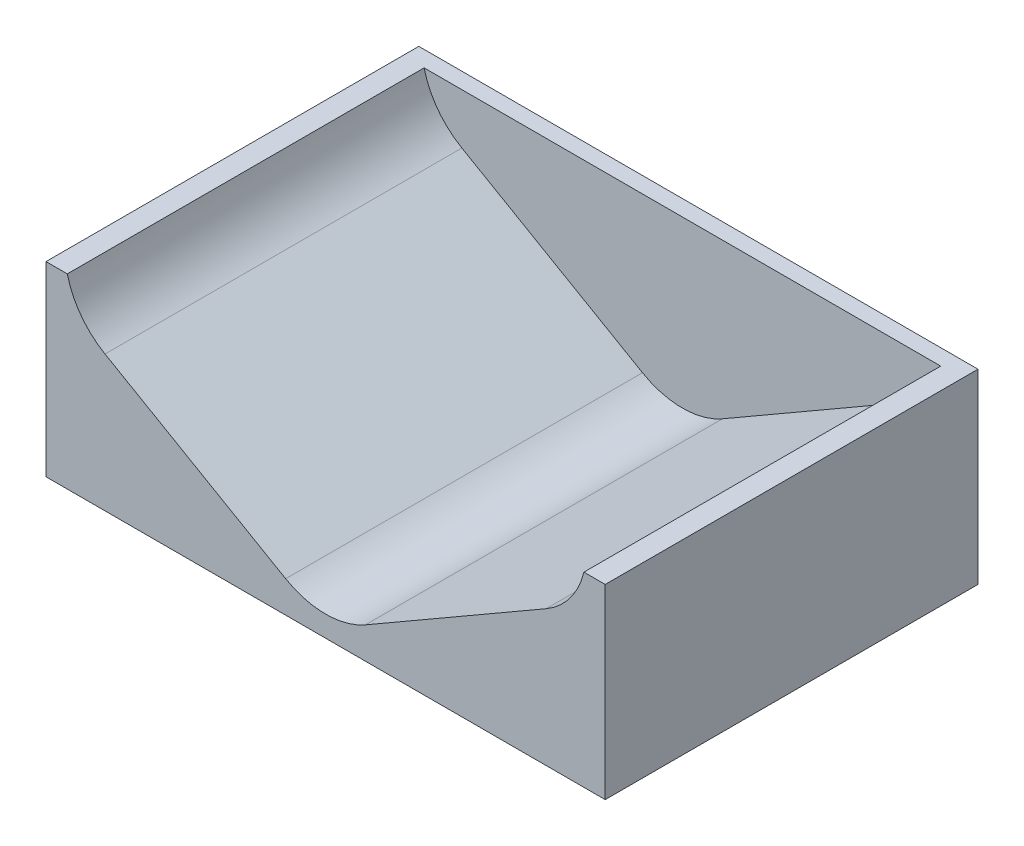
ISO-10303-21;
HEADER;
FILE_DESCRIPTION(('STEP AP214'),'2;1');
FILE_NAME('part.step','',(''),(''),'','','');
FILE_SCHEMA(('AUTOMOTIVE_DESIGN { 1 0 10303 214 1 1 1 1 }'));
ENDSEC;
DATA;
#1=APPLICATION_CONTEXT('core data for automotive mechanical design processes');
#2=APPLICATION_PROTOCOL_DEFINITION('international standard','automotive_design',2000,#1);
#3=PRODUCT_CONTEXT('',#1,'mechanical');
#4=PRODUCT('Part','Part','',(#3));
#5=PRODUCT_RELATED_PRODUCT_CATEGORY('part','',(#4));
#6=PRODUCT_DEFINITION_FORMATION('','',#4);
#7=PRODUCT_DEFINITION_CONTEXT('part definition',#1,'design');
#8=PRODUCT_DEFINITION('design','',#6,#7);
#9=PRODUCT_DEFINITION_SHAPE('','',#8);
#10=(LENGTH_UNIT() NAMED_UNIT(*) SI_UNIT(.MILLI.,.METRE.));
#11=(NAMED_UNIT(*) PLANE_ANGLE_UNIT() SI_UNIT($,.RADIAN.));
#12=(NAMED_UNIT(*) SI_UNIT($,.STERADIAN.) SOLID_ANGLE_UNIT());
#13=UNCERTAINTY_MEASURE_WITH_UNIT(LENGTH_MEASURE(1.E-05),#10,'distance_accuracy_value','');
#14=(GEOMETRIC_REPRESENTATION_CONTEXT(3) GLOBAL_UNCERTAINTY_ASSIGNED_CONTEXT((#13)) GLOBAL_UNIT_ASSIGNED_CONTEXT((#10,
#11,#12)) REPRESENTATION_CONTEXT('',''));
#15=CARTESIAN_POINT('',(0.,0.,0.));
#16=DIRECTION('',(0.,0.,1.));
#17=DIRECTION('',(1.,0.,0.));
#18=AXIS2_PLACEMENT_3D('',#15,#16,#17);
#19=CARTESIAN_POINT('',(-48.5,28.0014880556969,70.));
#20=DIRECTION('',(-0.500000000000001,-0.866025403784438,0.));
#21=DIRECTION('',(0.866025403784438,-0.500000000000001,0.));
#22=AXIS2_PLACEMENT_3D('',#19,#20,#21);
#23=PLANE('',#22);
#24=DIRECTION('',(0.866025403784438,-0.500000000000001,0.));
#25=VECTOR('',#24,1.);
#26=CARTESIAN_POINT('',(-48.5,28.0014880556969,3.));
#27=LINE('',#26,#25);
#28=CARTESIAN_POINT('',(-41.4142687030109,23.9105391839749,3.));
#29=VERTEX_POINT('',#28);
#30=CARTESIAN_POINT('',(-7.50000000000001,4.3301270189222,3.));
#31=VERTEX_POINT('',#30);
#32=EDGE_CURVE('E173',#29,#31,#27,.T.);
#33=ORIENTED_EDGE('',*,*,#32,.F.);
#34=DIRECTION('',(0.,0.,1.));
#35=VECTOR('',#34,1.);
#36=CARTESIAN_POINT('',(-41.4142687030109,23.9105391839749,70.));
#37=LINE('',#36,#35);
#38=CARTESIAN_POINT('',(-41.4142687030109,23.9105391839749,70.));
#39=VERTEX_POINT('',#38);
#40=EDGE_CURVE('E47',#29,#39,#37,.T.);
#41=ORIENTED_EDGE('',*,*,#40,.T.);
#42=DIRECTION('',(-0.866025403784438,0.500000000000001,0.));
#43=VECTOR('',#42,1.);
#44=CARTESIAN_POINT('',(-48.5,28.0014880556969,70.));
#45=LINE('',#44,#43);
#46=CARTESIAN_POINT('',(-7.50000000000001,4.33012701892221,70.));
#47=VERTEX_POINT('',#46);
#48=EDGE_CURVE('E167',#47,#39,#45,.T.);
#49=ORIENTED_EDGE('',*,*,#48,.F.);
#50=DIRECTION('',(0.,0.,-1.));
#51=VECTOR('',#50,1.);
#52=CARTESIAN_POINT('',(-7.50000000000001,4.33012701892221,0.));
#53=LINE('',#52,#51);
#54=EDGE_CURVE('E157',#47,#31,#53,.T.);
#55=ORIENTED_EDGE('',*,*,#54,.T.);
#56=EDGE_LOOP('',(#33,#41,#49,#55));
#57=FACE_BOUND('',#56,.T.);
#58=ADVANCED_FACE('F32',(#57),#23,.F.);
#59=CARTESIAN_POINT('',(0.,0.,70.));
#60=DIRECTION('',(0.500000000000001,-0.866025403784438,0.));
#61=DIRECTION('',(0.866025403784438,0.500000000000001,0.));
#62=AXIS2_PLACEMENT_3D('',#59,#60,#61);
#63=PLANE('',#62);
#64=DIRECTION('',(0.866025403784438,0.500000000000001,0.));
#65=VECTOR('',#64,1.);
#66=CARTESIAN_POINT('',(0.,0.,3.));
#67=LINE('',#66,#65);
#68=CARTESIAN_POINT('',(7.50000000000002,4.33012701892221,3.));
#69=VERTEX_POINT('',#68);
#70=CARTESIAN_POINT('',(41.414268703011,23.9105391839749,3.));
#71=VERTEX_POINT('',#70);
#72=EDGE_CURVE('E114',#69,#71,#67,.T.);
#73=ORIENTED_EDGE('',*,*,#72,.F.);
#74=DIRECTION('',(0.,0.,-1.));
#75=VECTOR('',#74,1.);
#76=CARTESIAN_POINT('',(7.50000000000001,4.33012701892221,70.));
#77=LINE('',#76,#75);
#78=CARTESIAN_POINT('',(7.50000000000002,4.33012701892221,70.));
#79=VERTEX_POINT('',#78);
#80=EDGE_CURVE('E153',#69,#79,#77,.F.);
#81=ORIENTED_EDGE('',*,*,#80,.T.);
#82=DIRECTION('',(-0.866025403784438,-0.500000000000001,0.));
#83=VECTOR('',#82,1.);
#84=CARTESIAN_POINT('',(0.,0.,70.));
#85=LINE('',#84,#83);
#86=CARTESIAN_POINT('',(41.414268703011,23.9105391839749,70.));
#87=VERTEX_POINT('',#86);
#88=EDGE_CURVE('E137',#87,#79,#85,.T.);
#89=ORIENTED_EDGE('',*,*,#88,.F.);
#90=DIRECTION('',(0.,0.,-1.));
#91=VECTOR('',#90,1.);
#92=CARTESIAN_POINT('',(41.4142687030109,23.9105391839749,70.));
#93=LINE('',#92,#91);
#94=EDGE_CURVE('E155',#87,#71,#93,.T.);
#95=ORIENTED_EDGE('',*,*,#94,.T.);
#96=EDGE_LOOP('',(#73,#81,#89,#95));
#97=FACE_BOUND('',#96,.T.);
#98=ADVANCED_FACE('F210',(#97),#63,.F.);
#99=CARTESIAN_POINT('',(33.9142687030109,36.9009202407415,70.));
#100=DIRECTION('',(0.,0.,-1.));
#101=DIRECTION('',(-1.,0.,0.));
#102=AXIS2_PLACEMENT_3D('',#99,#100,#101);
#103=CYLINDRICAL_SURFACE('',#102,15.);
#104=CARTESIAN_POINT('',(33.9142687030109,36.9009202407415,3.));
#105=DIRECTION('',(0.,0.,-1.));
#106=DIRECTION('',(-1.,0.,0.));
#107=AXIS2_PLACEMENT_3D('',#104,#105,#106);
#108=CIRCLE('',#107,15.);
#109=CARTESIAN_POINT('',(48.5,33.4,3.));
#110=VERTEX_POINT('',#109);
#111=EDGE_CURVE('E108',#71,#110,#108,.F.);
#112=ORIENTED_EDGE('',*,*,#111,.F.);
#113=ORIENTED_EDGE('',*,*,#94,.F.);
#114=CARTESIAN_POINT('',(33.9142687030109,36.9009202407415,70.));
#115=DIRECTION('',(0.,0.,1.));
#116=DIRECTION('',(1.,0.,0.));
#117=AXIS2_PLACEMENT_3D('',#114,#115,#116);
#118=CIRCLE('',#117,15.);
#119=CARTESIAN_POINT('',(48.5,33.4,70.));
#120=VERTEX_POINT('',#119);
#121=EDGE_CURVE('E135',#120,#87,#118,.F.);
#122=ORIENTED_EDGE('',*,*,#121,.F.);
#123=DIRECTION('',(0.,0.,-1.));
#124=VECTOR('',#123,1.);
#125=CARTESIAN_POINT('',(48.5,33.4,70.));
#126=LINE('',#125,#124);
#127=EDGE_CURVE('E128',#120,#110,#126,.T.);
#128=ORIENTED_EDGE('',*,*,#127,.T.);
#129=EDGE_LOOP('',(#112,#113,#122,#128));
#130=FACE_BOUND('',#129,.T.);
#131=ADVANCED_FACE('F134',(#130),#103,.F.);
#132=CARTESIAN_POINT('',(-33.9142687030109,36.9009202407415,70.));
#133=DIRECTION('',(0.,0.,1.));
#134=DIRECTION('',(1.,0.,0.));
#135=AXIS2_PLACEMENT_3D('',#132,#133,#134);
#136=CYLINDRICAL_SURFACE('',#135,15.);
#137=CARTESIAN_POINT('',(-33.9142687030109,36.9009202407415,3.));
#138=DIRECTION('',(0.,0.,-1.));
#139=DIRECTION('',(-1.,0.,0.));
#140=AXIS2_PLACEMENT_3D('',#137,#138,#139);
#141=CIRCLE('',#140,15.);
#142=CARTESIAN_POINT('',(-48.5,33.4,3.));
#143=VERTEX_POINT('',#142);
#144=EDGE_CURVE('E120',#143,#29,#141,.F.);
#145=ORIENTED_EDGE('',*,*,#144,.F.);
#146=DIRECTION('',(0.,0.,-1.));
#147=VECTOR('',#146,1.);
#148=CARTESIAN_POINT('',(-48.5,33.4,70.));
#149=LINE('',#148,#147);
#150=CARTESIAN_POINT('',(-48.5,33.4,70.));
#151=VERTEX_POINT('',#150);
#152=EDGE_CURVE('E132',#151,#143,#149,.T.);
#153=ORIENTED_EDGE('',*,*,#152,.F.);
#154=CARTESIAN_POINT('',(-33.9142687030109,36.9009202407415,70.));
#155=DIRECTION('',(0.,0.,1.));
#156=DIRECTION('',(1.,0.,0.));
#157=AXIS2_PLACEMENT_3D('',#154,#155,#156);
#158=CIRCLE('',#157,15.);
#159=EDGE_CURVE('E162',#39,#151,#158,.F.);
#160=ORIENTED_EDGE('',*,*,#159,.F.);
#161=ORIENTED_EDGE('',*,*,#40,.F.);
#162=EDGE_LOOP('',(#145,#153,#160,#161));
#163=FACE_BOUND('',#162,.T.);
#164=ADVANCED_FACE('F172',(#163),#136,.F.);
#165=CARTESIAN_POINT('',(0.,17.3205080756888,70.));
#166=DIRECTION('',(0.,0.,1.));
#167=DIRECTION('',(1.,0.,0.));
#168=AXIS2_PLACEMENT_3D('',#165,#166,#167);
#169=CYLINDRICAL_SURFACE('',#168,15.);
#170=CARTESIAN_POINT('',(0.,17.3205080756888,3.));
#171=DIRECTION('',(0.,0.,-1.));
#172=DIRECTION('',(-1.,0.,0.));
#173=AXIS2_PLACEMENT_3D('',#170,#171,#172);
#174=CIRCLE('',#173,15.);
#175=EDGE_CURVE('E11',#31,#69,#174,.F.);
#176=ORIENTED_EDGE('',*,*,#175,.F.);
#177=ORIENTED_EDGE('',*,*,#54,.F.);
#178=CARTESIAN_POINT('',(0.,17.3205080756888,70.));
#179=DIRECTION('',(0.,0.,1.));
#180=DIRECTION('',(1.,0.,0.));
#181=AXIS2_PLACEMENT_3D('',#178,#179,#180);
#182=CIRCLE('',#181,15.);
#183=EDGE_CURVE('E40',#79,#47,#182,.F.);
#184=ORIENTED_EDGE('',*,*,#183,.F.);
#185=ORIENTED_EDGE('',*,*,#80,.F.);
#186=EDGE_LOOP('',(#176,#177,#184,#185));
#187=FACE_BOUND('',#186,.T.);
#188=ADVANCED_FACE('F34',(#187),#169,.F.);
#189=CARTESIAN_POINT('',(-52.5,33.4,70.));
#190=DIRECTION('',(1.,0.,0.));
#191=DIRECTION('',(0.,0.,-1.));
#192=AXIS2_PLACEMENT_3D('',#189,#190,#191);
#193=PLANE('',#192);
#194=DIRECTION('',(0.,-1.,0.));
#195=VECTOR('',#194,1.);
#196=CARTESIAN_POINT('',(-52.5,33.4,0.));
#197=LINE('',#196,#195);
#198=CARTESIAN_POINT('',(-52.5,33.4,0.));
#199=VERTEX_POINT('',#198);
#200=CARTESIAN_POINT('',(-52.5,-1.60000000000001,0.));
#201=VERTEX_POINT('',#200);
#202=EDGE_CURVE('E119',#199,#201,#197,.T.);
#203=ORIENTED_EDGE('',*,*,#202,.T.);
#204=DIRECTION('',(0.,0.,-1.));
#205=VECTOR('',#204,1.);
#206=CARTESIAN_POINT('',(-52.5,-1.60000000000001,70.));
#207=LINE('',#206,#205);
#208=CARTESIAN_POINT('',(-52.5,-1.60000000000001,70.));
#209=VERTEX_POINT('',#208);
#210=EDGE_CURVE('E148',#209,#201,#207,.T.);
#211=ORIENTED_EDGE('',*,*,#210,.F.);
#212=DIRECTION('',(0.,-1.,0.));
#213=VECTOR('',#212,1.);
#214=CARTESIAN_POINT('',(-52.5,33.4,70.));
#215=LINE('',#214,#213);
#216=CARTESIAN_POINT('',(-52.5,33.4,70.));
#217=VERTEX_POINT('',#216);
#218=EDGE_CURVE('E170',#217,#209,#215,.T.);
#219=ORIENTED_EDGE('',*,*,#218,.F.);
#220=DIRECTION('',(0.,0.,-1.));
#221=VECTOR('',#220,1.);
#222=CARTESIAN_POINT('',(-52.5,33.4,70.));
#223=LINE('',#222,#221);
#224=EDGE_CURVE('E150',#217,#199,#223,.T.);
#225=ORIENTED_EDGE('',*,*,#224,.T.);
#226=EDGE_LOOP('',(#203,#211,#219,#225));
#227=FACE_BOUND('',#226,.T.);
#228=ADVANCED_FACE('F201',(#227),#193,.F.);
#229=CARTESIAN_POINT('',(52.5,-1.60000000000001,70.));
#230=DIRECTION('',(0.,1.,0.));
#231=DIRECTION('',(0.,0.,1.));
#232=AXIS2_PLACEMENT_3D('',#229,#230,#231);
#233=PLANE('',#232);
#234=DIRECTION('',(1.,0.,0.));
#235=VECTOR('',#234,1.);
#236=CARTESIAN_POINT('',(52.5,-1.60000000000001,0.));
#237=LINE('',#236,#235);
#238=CARTESIAN_POINT('',(52.5,-1.60000000000001,0.));
#239=VERTEX_POINT('',#238);
#240=EDGE_CURVE('E187',#201,#239,#237,.T.);
#241=ORIENTED_EDGE('',*,*,#240,.T.);
#242=DIRECTION('',(0.,0.,-1.));
#243=VECTOR('',#242,1.);
#244=CARTESIAN_POINT('',(52.5,-1.60000000000001,70.));
#245=LINE('',#244,#243);
#246=CARTESIAN_POINT('',(52.5,-1.60000000000001,70.));
#247=VERTEX_POINT('',#246);
#248=EDGE_CURVE('E139',#247,#239,#245,.T.);
#249=ORIENTED_EDGE('',*,*,#248,.F.);
#250=DIRECTION('',(1.,0.,0.));
#251=VECTOR('',#250,1.);
#252=CARTESIAN_POINT('',(52.5,-1.60000000000001,70.));
#253=LINE('',#252,#251);
#254=EDGE_CURVE('E180',#209,#247,#253,.T.);
#255=ORIENTED_EDGE('',*,*,#254,.F.);
#256=ORIENTED_EDGE('',*,*,#210,.T.);
#257=EDGE_LOOP('',(#241,#249,#255,#256));
#258=FACE_BOUND('',#257,.T.);
#259=ADVANCED_FACE('F206',(#258),#233,.F.);
#260=CARTESIAN_POINT('',(52.5,33.4,70.));
#261=DIRECTION('',(-1.,0.,0.));
#262=DIRECTION('',(0.,0.,1.));
#263=AXIS2_PLACEMENT_3D('',#260,#261,#262);
#264=PLANE('',#263);
#265=DIRECTION('',(0.,1.,0.));
#266=VECTOR('',#265,1.);
#267=CARTESIAN_POINT('',(52.5,33.4,0.));
#268=LINE('',#267,#266);
#269=CARTESIAN_POINT('',(52.5,33.4,0.));
#270=VERTEX_POINT('',#269);
#271=EDGE_CURVE('E189',#239,#270,#268,.T.);
#272=ORIENTED_EDGE('',*,*,#271,.T.);
#273=DIRECTION('',(0.,0.,-1.));
#274=VECTOR('',#273,1.);
#275=CARTESIAN_POINT('',(52.5,33.4,70.));
#276=LINE('',#275,#274);
#277=CARTESIAN_POINT('',(52.5,33.4,70.));
#278=VERTEX_POINT('',#277);
#279=EDGE_CURVE('E136',#278,#270,#276,.T.);
#280=ORIENTED_EDGE('',*,*,#279,.F.);
#281=DIRECTION('',(0.,1.,0.));
#282=VECTOR('',#281,1.);
#283=CARTESIAN_POINT('',(52.5,33.4,70.));
#284=LINE('',#283,#282);
#285=EDGE_CURVE('E182',#247,#278,#284,.T.);
#286=ORIENTED_EDGE('',*,*,#285,.F.);
#287=ORIENTED_EDGE('',*,*,#248,.T.);
#288=EDGE_LOOP('',(#272,#280,#286,#287));
#289=FACE_BOUND('',#288,.T.);
#290=ADVANCED_FACE('F207',(#289),#264,.F.);
#291=CARTESIAN_POINT('',(48.5,33.4,70.));
#292=DIRECTION('',(0.,-1.,0.));
#293=DIRECTION('',(0.,0.,-1.));
#294=AXIS2_PLACEMENT_3D('',#291,#292,#293);
#295=PLANE('',#294);
#296=DIRECTION('',(-1.,0.,0.));
#297=VECTOR('',#296,1.);
#298=CARTESIAN_POINT('',(48.5,33.4,0.));
#299=LINE('',#298,#297);
#300=EDGE_CURVE('E144',#270,#199,#299,.T.);
#301=ORIENTED_EDGE('',*,*,#300,.T.);
#302=ORIENTED_EDGE('',*,*,#224,.F.);
#303=DIRECTION('',(-1.,0.,0.));
#304=VECTOR('',#303,1.);
#305=CARTESIAN_POINT('',(-48.5,33.4,70.));
#306=LINE('',#305,#304);
#307=EDGE_CURVE('E165',#151,#217,#306,.T.);
#308=ORIENTED_EDGE('',*,*,#307,.F.);
#309=ORIENTED_EDGE('',*,*,#152,.T.);
#310=DIRECTION('',(-1.,0.,0.));
#311=VECTOR('',#310,1.);
#312=CARTESIAN_POINT('',(-52.5,33.4,3.));
#313=LINE('',#312,#311);
#314=EDGE_CURVE('E111',#110,#143,#313,.T.);
#315=ORIENTED_EDGE('',*,*,#314,.F.);
#316=ORIENTED_EDGE('',*,*,#127,.F.);
#317=DIRECTION('',(-1.,0.,0.));
#318=VECTOR('',#317,1.);
#319=CARTESIAN_POINT('',(48.5,33.4,70.));
#320=LINE('',#319,#318);
#321=EDGE_CURVE('E141',#278,#120,#320,.T.);
#322=ORIENTED_EDGE('',*,*,#321,.F.);
#323=ORIENTED_EDGE('',*,*,#279,.T.);
#324=EDGE_LOOP('',(#301,#302,#308,#309,#315,#316,#322,#323));
#325=FACE_BOUND('',#324,.T.);
#326=ADVANCED_FACE('F126',(#325),#295,.F.);
#327=CARTESIAN_POINT('',(0.,0.,70.));
#328=DIRECTION('',(0.,0.,1.));
#329=DIRECTION('',(1.,0.,0.));
#330=AXIS2_PLACEMENT_3D('',#327,#328,#329);
#331=PLANE('',#330);
#332=ORIENTED_EDGE('',*,*,#88,.T.);
#333=ORIENTED_EDGE('',*,*,#183,.T.);
#334=ORIENTED_EDGE('',*,*,#48,.T.);
#335=ORIENTED_EDGE('',*,*,#159,.T.);
#336=ORIENTED_EDGE('',*,*,#307,.T.);
#337=ORIENTED_EDGE('',*,*,#218,.T.);
#338=ORIENTED_EDGE('',*,*,#254,.T.);
#339=ORIENTED_EDGE('',*,*,#285,.T.);
#340=ORIENTED_EDGE('',*,*,#321,.T.);
#341=ORIENTED_EDGE('',*,*,#121,.T.);
#342=EDGE_LOOP('',(#332,#333,#334,#335,#336,#337,#338,#339,#340,#341));
#343=FACE_BOUND('',#342,.T.);
#344=ADVANCED_FACE('F164',(#343),#331,.T.);
#345=CARTESIAN_POINT('',(0.,0.,0.));
#346=DIRECTION('',(0.,0.,1.));
#347=DIRECTION('',(1.,0.,0.));
#348=AXIS2_PLACEMENT_3D('',#345,#346,#347);
#349=PLANE('',#348);
#350=ORIENTED_EDGE('',*,*,#202,.F.);
#351=ORIENTED_EDGE('',*,*,#300,.F.);
#352=ORIENTED_EDGE('',*,*,#271,.F.);
#353=ORIENTED_EDGE('',*,*,#240,.F.);
#354=EDGE_LOOP('',(#350,#351,#352,#353));
#355=FACE_BOUND('',#354,.T.);
#356=ADVANCED_FACE('F198',(#355),#349,.F.);
#357=CARTESIAN_POINT('',(0.,0.,3.));
#358=DIRECTION('',(0.,0.,-1.));
#359=DIRECTION('',(-1.,0.,0.));
#360=AXIS2_PLACEMENT_3D('',#357,#358,#359);
#361=PLANE('',#360);
#362=ORIENTED_EDGE('',*,*,#72,.T.);
#363=ORIENTED_EDGE('',*,*,#111,.T.);
#364=ORIENTED_EDGE('',*,*,#314,.T.);
#365=ORIENTED_EDGE('',*,*,#144,.T.);
#366=ORIENTED_EDGE('',*,*,#32,.T.);
#367=ORIENTED_EDGE('',*,*,#175,.T.);
#368=EDGE_LOOP('',(#362,#363,#364,#365,#366,#367));
#369=FACE_BOUND('',#368,.T.);
#370=ADVANCED_FACE('F110',(#369),#361,.F.);
#371=CLOSED_SHELL('',(#58,#98,#131,#164,#188,#228,#259,#290,#326,#344,#356,#370));
#372=MANIFOLD_SOLID_BREP('B2',#371);
#373=ADVANCED_BREP_SHAPE_REPRESENTATION('',(#18,#372),#14);
#374=SHAPE_DEFINITION_REPRESENTATION(#9,#373);
ENDSEC;
END-ISO-10303-21;
